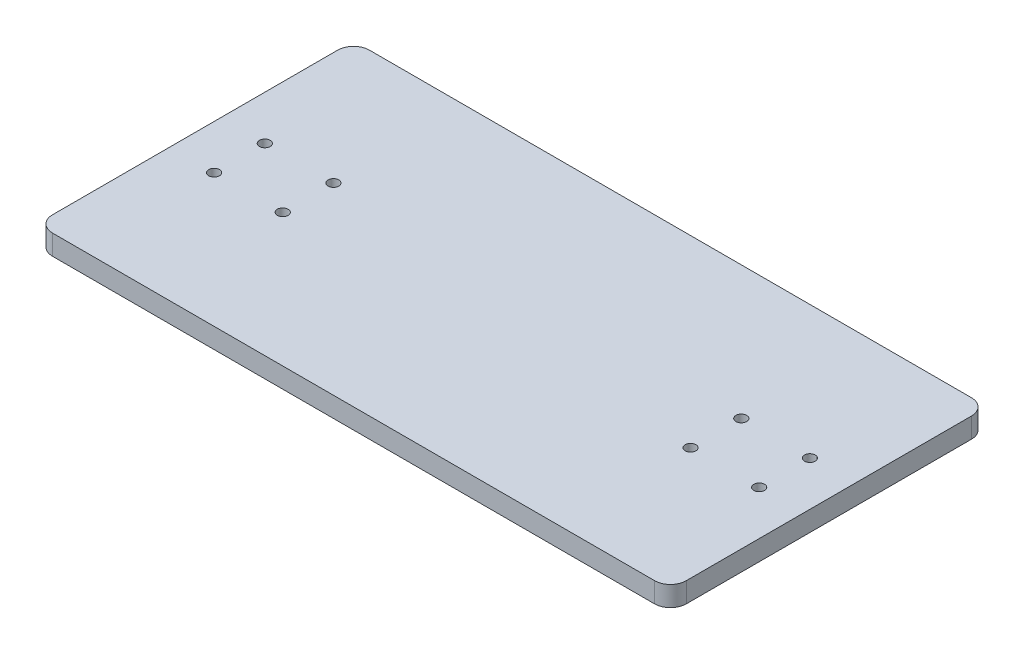
ISO-10303-21;
HEADER;
FILE_DESCRIPTION(('STEP AP214'),'2;1');
FILE_NAME('part.step','',(''),(''),'','','');
FILE_SCHEMA(('AUTOMOTIVE_DESIGN { 1 0 10303 214 1 1 1 1 }'));
ENDSEC;
DATA;
#1=APPLICATION_CONTEXT('core data for automotive mechanical design processes');
#2=APPLICATION_PROTOCOL_DEFINITION('international standard','automotive_design',2000,#1);
#3=PRODUCT_CONTEXT('',#1,'mechanical');
#4=PRODUCT('Part','Part','',(#3));
#5=PRODUCT_RELATED_PRODUCT_CATEGORY('part','',(#4));
#6=PRODUCT_DEFINITION_FORMATION('','',#4);
#7=PRODUCT_DEFINITION_CONTEXT('part definition',#1,'design');
#8=PRODUCT_DEFINITION('design','',#6,#7);
#9=PRODUCT_DEFINITION_SHAPE('','',#8);
#10=(LENGTH_UNIT() NAMED_UNIT(*) SI_UNIT(.MILLI.,.METRE.));
#11=(NAMED_UNIT(*) PLANE_ANGLE_UNIT() SI_UNIT($,.RADIAN.));
#12=(NAMED_UNIT(*) SI_UNIT($,.STERADIAN.) SOLID_ANGLE_UNIT());
#13=UNCERTAINTY_MEASURE_WITH_UNIT(LENGTH_MEASURE(1.E-05),#10,'distance_accuracy_value','');
#14=(GEOMETRIC_REPRESENTATION_CONTEXT(3) GLOBAL_UNCERTAINTY_ASSIGNED_CONTEXT((#13)) GLOBAL_UNIT_ASSIGNED_CONTEXT((#10,
#11,#12)) REPRESENTATION_CONTEXT('',''));
#15=CARTESIAN_POINT('',(0.,0.,0.));
#16=DIRECTION('',(0.,0.,1.));
#17=DIRECTION('',(1.,0.,0.));
#18=AXIS2_PLACEMENT_3D('',#15,#16,#17);
#19=CARTESIAN_POINT('',(0.,6.35,0.));
#20=DIRECTION('',(0.,1.,0.));
#21=DIRECTION('',(0.,0.,1.));
#22=AXIS2_PLACEMENT_3D('',#19,#20,#21);
#23=PLANE('',#22);
#24=CARTESIAN_POINT('',(64.35,6.35,8.));
#25=DIRECTION('',(0.,1.,0.));
#26=DIRECTION('',(0.,0.,1.));
#27=AXIS2_PLACEMENT_3D('',#24,#25,#26);
#28=CIRCLE('',#27,1.7);
#29=CARTESIAN_POINT('',(64.35,6.35,9.7));
#30=VERTEX_POINT('',#29);
#31=EDGE_CURVE('E255',#30,#30,#28,.T.);
#32=ORIENTED_EDGE('',*,*,#31,.F.);
#33=EDGE_LOOP('',(#32));
#34=FACE_BOUND('',#33,.T.);
#35=CARTESIAN_POINT('',(-64.35,6.35,-7.99999999999999));
#36=DIRECTION('',(0.,1.,0.));
#37=DIRECTION('',(0.,0.,1.));
#38=AXIS2_PLACEMENT_3D('',#35,#36,#37);
#39=CIRCLE('',#38,1.7);
#40=CARTESIAN_POINT('',(-64.35,6.35,-6.3));
#41=VERTEX_POINT('',#40);
#42=EDGE_CURVE('E239',#41,#41,#39,.T.);
#43=ORIENTED_EDGE('',*,*,#42,.F.);
#44=EDGE_LOOP('',(#43));
#45=FACE_BOUND('',#44,.T.);
#46=CARTESIAN_POINT('',(86.,6.35,8.00000000000001));
#47=DIRECTION('',(0.,1.,0.));
#48=DIRECTION('',(0.,0.,1.));
#49=AXIS2_PLACEMENT_3D('',#46,#47,#48);
#50=CIRCLE('',#49,1.7);
#51=CARTESIAN_POINT('',(86.,6.35,9.70000000000001));
#52=VERTEX_POINT('',#51);
#53=EDGE_CURVE('E223',#52,#52,#50,.T.);
#54=ORIENTED_EDGE('',*,*,#53,.F.);
#55=EDGE_LOOP('',(#54));
#56=FACE_BOUND('',#55,.T.);
#57=CARTESIAN_POINT('',(-86.,6.35,-8.));
#58=DIRECTION('',(0.,1.,0.));
#59=DIRECTION('',(0.,0.,1.));
#60=AXIS2_PLACEMENT_3D('',#57,#58,#59);
#61=CIRCLE('',#60,1.7);
#62=CARTESIAN_POINT('',(-86.,6.35,-6.3));
#63=VERTEX_POINT('',#62);
#64=EDGE_CURVE('E141',#63,#63,#61,.T.);
#65=ORIENTED_EDGE('',*,*,#64,.F.);
#66=EDGE_LOOP('',(#65));
#67=FACE_BOUND('',#66,.T.);
#68=DIRECTION('',(-1.,0.,0.));
#69=VECTOR('',#68,1.);
#70=CARTESIAN_POINT('',(100.,6.35,-50.));
#71=LINE('',#70,#69);
#72=CARTESIAN_POINT('',(95.,6.35,-50.));
#73=VERTEX_POINT('',#72);
#74=CARTESIAN_POINT('',(-95.,6.35,-50.));
#75=VERTEX_POINT('',#74);
#76=EDGE_CURVE('E152',#73,#75,#71,.T.);
#77=ORIENTED_EDGE('',*,*,#76,.T.);
#78=CARTESIAN_POINT('',(-95.,6.35,-45.));
#79=DIRECTION('',(0.,1.,0.));
#80=DIRECTION('',(0.,0.,1.));
#81=AXIS2_PLACEMENT_3D('',#78,#79,#80);
#82=CIRCLE('',#81,5.);
#83=CARTESIAN_POINT('',(-100.,6.35,-45.));
#84=VERTEX_POINT('',#83);
#85=EDGE_CURVE('E182',#75,#84,#82,.T.);
#86=ORIENTED_EDGE('',*,*,#85,.T.);
#87=DIRECTION('',(0.,0.,1.));
#88=VECTOR('',#87,1.);
#89=CARTESIAN_POINT('',(-100.,6.35,50.));
#90=LINE('',#89,#88);
#91=CARTESIAN_POINT('',(-100.,6.35,45.));
#92=VERTEX_POINT('',#91);
#93=EDGE_CURVE('E131',#84,#92,#90,.T.);
#94=ORIENTED_EDGE('',*,*,#93,.T.);
#95=CARTESIAN_POINT('',(-95.,6.35,45.));
#96=DIRECTION('',(0.,1.,0.));
#97=DIRECTION('',(0.,0.,1.));
#98=AXIS2_PLACEMENT_3D('',#95,#96,#97);
#99=CIRCLE('',#98,5.);
#100=CARTESIAN_POINT('',(-95.,6.35,50.));
#101=VERTEX_POINT('',#100);
#102=EDGE_CURVE('E174',#92,#101,#99,.T.);
#103=ORIENTED_EDGE('',*,*,#102,.T.);
#104=DIRECTION('',(1.,0.,0.));
#105=VECTOR('',#104,1.);
#106=CARTESIAN_POINT('',(100.,6.35,50.));
#107=LINE('',#106,#105);
#108=CARTESIAN_POINT('',(95.,6.35,50.));
#109=VERTEX_POINT('',#108);
#110=EDGE_CURVE('E197',#101,#109,#107,.T.);
#111=ORIENTED_EDGE('',*,*,#110,.T.);
#112=CARTESIAN_POINT('',(95.,6.35,45.));
#113=DIRECTION('',(0.,1.,0.));
#114=DIRECTION('',(0.,0.,1.));
#115=AXIS2_PLACEMENT_3D('',#112,#113,#114);
#116=CIRCLE('',#115,5.);
#117=CARTESIAN_POINT('',(100.,6.35,45.));
#118=VERTEX_POINT('',#117);
#119=EDGE_CURVE('E66',#109,#118,#116,.T.);
#120=ORIENTED_EDGE('',*,*,#119,.T.);
#121=DIRECTION('',(0.,0.,-1.));
#122=VECTOR('',#121,1.);
#123=CARTESIAN_POINT('',(100.,6.35,50.));
#124=LINE('',#123,#122);
#125=CARTESIAN_POINT('',(100.,6.35,-45.));
#126=VERTEX_POINT('',#125);
#127=EDGE_CURVE('E205',#118,#126,#124,.T.);
#128=ORIENTED_EDGE('',*,*,#127,.T.);
#129=CARTESIAN_POINT('',(95.,6.35,-45.));
#130=DIRECTION('',(0.,1.,0.));
#131=DIRECTION('',(0.,0.,1.));
#132=AXIS2_PLACEMENT_3D('',#129,#130,#131);
#133=CIRCLE('',#132,5.);
#134=EDGE_CURVE('E179',#126,#73,#133,.T.);
#135=ORIENTED_EDGE('',*,*,#134,.T.);
#136=EDGE_LOOP('',(#77,#86,#94,#103,#111,#120,#128,#135));
#137=FACE_BOUND('',#136,.T.);
#138=CARTESIAN_POINT('',(-86.,6.35,8.00000000000001));
#139=DIRECTION('',(0.,1.,0.));
#140=DIRECTION('',(0.,0.,-1.));
#141=AXIS2_PLACEMENT_3D('',#138,#139,#140);
#142=CIRCLE('',#141,1.7);
#143=CARTESIAN_POINT('',(-86.,6.35,6.30000000000001));
#144=VERTEX_POINT('',#143);
#145=EDGE_CURVE('E217',#144,#144,#142,.T.);
#146=ORIENTED_EDGE('',*,*,#145,.F.);
#147=EDGE_LOOP('',(#146));
#148=FACE_BOUND('',#147,.T.);
#149=CARTESIAN_POINT('',(86.,6.35,-8.));
#150=DIRECTION('',(0.,1.,0.));
#151=DIRECTION('',(0.,0.,-1.));
#152=AXIS2_PLACEMENT_3D('',#149,#150,#151);
#153=CIRCLE('',#152,1.7);
#154=CARTESIAN_POINT('',(86.,6.35,-9.7));
#155=VERTEX_POINT('',#154);
#156=EDGE_CURVE('E231',#155,#155,#153,.T.);
#157=ORIENTED_EDGE('',*,*,#156,.F.);
#158=EDGE_LOOP('',(#157));
#159=FACE_BOUND('',#158,.T.);
#160=CARTESIAN_POINT('',(-64.35,6.35,8.));
#161=DIRECTION('',(0.,1.,0.));
#162=DIRECTION('',(0.,0.,-1.));
#163=AXIS2_PLACEMENT_3D('',#160,#161,#162);
#164=CIRCLE('',#163,1.7);
#165=CARTESIAN_POINT('',(-64.35,6.35,6.3));
#166=VERTEX_POINT('',#165);
#167=EDGE_CURVE('E247',#166,#166,#164,.T.);
#168=ORIENTED_EDGE('',*,*,#167,.F.);
#169=EDGE_LOOP('',(#168));
#170=FACE_BOUND('',#169,.T.);
#171=CARTESIAN_POINT('',(64.35,6.35,-7.99999999999999));
#172=DIRECTION('',(0.,1.,0.));
#173=DIRECTION('',(0.,0.,-1.));
#174=AXIS2_PLACEMENT_3D('',#171,#172,#173);
#175=CIRCLE('',#174,1.7);
#176=CARTESIAN_POINT('',(64.35,6.35,-9.69999999999999));
#177=VERTEX_POINT('',#176);
#178=EDGE_CURVE('E263',#177,#177,#175,.T.);
#179=ORIENTED_EDGE('',*,*,#178,.F.);
#180=EDGE_LOOP('',(#179));
#181=FACE_BOUND('',#180,.T.);
#182=ADVANCED_FACE('F43',(#34,#45,#56,#67,#137,#148,#159,#170,#181),#23,.T.);
#183=CARTESIAN_POINT('',(0.,0.,0.));
#184=DIRECTION('',(0.,1.,0.));
#185=DIRECTION('',(0.,0.,1.));
#186=AXIS2_PLACEMENT_3D('',#183,#184,#185);
#187=PLANE('',#186);
#188=DIRECTION('',(0.,0.,1.));
#189=VECTOR('',#188,1.);
#190=CARTESIAN_POINT('',(-100.,0.,50.));
#191=LINE('',#190,#189);
#192=CARTESIAN_POINT('',(-100.,0.,-45.));
#193=VERTEX_POINT('',#192);
#194=CARTESIAN_POINT('',(-100.,0.,45.));
#195=VERTEX_POINT('',#194);
#196=EDGE_CURVE('E128',#193,#195,#191,.T.);
#197=ORIENTED_EDGE('',*,*,#196,.F.);
#198=CARTESIAN_POINT('',(-95.,0.,-45.));
#199=DIRECTION('',(0.,1.,0.));
#200=DIRECTION('',(0.,0.,1.));
#201=AXIS2_PLACEMENT_3D('',#198,#199,#200);
#202=CIRCLE('',#201,5.);
#203=CARTESIAN_POINT('',(-95.,0.,-50.));
#204=VERTEX_POINT('',#203);
#205=EDGE_CURVE('E110',#193,#204,#202,.F.);
#206=ORIENTED_EDGE('',*,*,#205,.T.);
#207=DIRECTION('',(-1.,0.,0.));
#208=VECTOR('',#207,1.);
#209=CARTESIAN_POINT('',(100.,0.,-50.));
#210=LINE('',#209,#208);
#211=CARTESIAN_POINT('',(95.,0.,-50.));
#212=VERTEX_POINT('',#211);
#213=EDGE_CURVE('E157',#212,#204,#210,.T.);
#214=ORIENTED_EDGE('',*,*,#213,.F.);
#215=CARTESIAN_POINT('',(95.,0.,-45.));
#216=DIRECTION('',(0.,1.,0.));
#217=DIRECTION('',(0.,0.,1.));
#218=AXIS2_PLACEMENT_3D('',#215,#216,#217);
#219=CIRCLE('',#218,5.);
#220=CARTESIAN_POINT('',(100.,0.,-45.));
#221=VERTEX_POINT('',#220);
#222=EDGE_CURVE('E122',#212,#221,#219,.F.);
#223=ORIENTED_EDGE('',*,*,#222,.T.);
#224=DIRECTION('',(0.,0.,-1.));
#225=VECTOR('',#224,1.);
#226=CARTESIAN_POINT('',(100.,0.,50.));
#227=LINE('',#226,#225);
#228=CARTESIAN_POINT('',(100.,0.,45.));
#229=VERTEX_POINT('',#228);
#230=EDGE_CURVE('E146',#229,#221,#227,.T.);
#231=ORIENTED_EDGE('',*,*,#230,.F.);
#232=CARTESIAN_POINT('',(95.,0.,45.));
#233=DIRECTION('',(0.,1.,0.));
#234=DIRECTION('',(0.,0.,1.));
#235=AXIS2_PLACEMENT_3D('',#232,#233,#234);
#236=CIRCLE('',#235,5.);
#237=CARTESIAN_POINT('',(95.,0.,50.));
#238=VERTEX_POINT('',#237);
#239=EDGE_CURVE('E164',#229,#238,#236,.F.);
#240=ORIENTED_EDGE('',*,*,#239,.T.);
#241=DIRECTION('',(1.,0.,0.));
#242=VECTOR('',#241,1.);
#243=CARTESIAN_POINT('',(100.,0.,50.));
#244=LINE('',#243,#242);
#245=CARTESIAN_POINT('',(-95.,0.,50.));
#246=VERTEX_POINT('',#245);
#247=EDGE_CURVE('E140',#246,#238,#244,.T.);
#248=ORIENTED_EDGE('',*,*,#247,.F.);
#249=CARTESIAN_POINT('',(-95.,0.,45.));
#250=DIRECTION('',(0.,1.,0.));
#251=DIRECTION('',(0.,0.,1.));
#252=AXIS2_PLACEMENT_3D('',#249,#250,#251);
#253=CIRCLE('',#252,5.);
#254=EDGE_CURVE('E133',#246,#195,#253,.F.);
#255=ORIENTED_EDGE('',*,*,#254,.T.);
#256=EDGE_LOOP('',(#197,#206,#214,#223,#231,#240,#248,#255));
#257=FACE_BOUND('',#256,.T.);
#258=CARTESIAN_POINT('',(-86.,0.,-8.));
#259=DIRECTION('',(0.,1.,0.));
#260=DIRECTION('',(0.,0.,1.));
#261=AXIS2_PLACEMENT_3D('',#258,#259,#260);
#262=CIRCLE('',#261,1.7);
#263=CARTESIAN_POINT('',(-86.,0.,-6.3));
#264=VERTEX_POINT('',#263);
#265=EDGE_CURVE('E149',#264,#264,#262,.T.);
#266=ORIENTED_EDGE('',*,*,#265,.T.);
#267=EDGE_LOOP('',(#266));
#268=FACE_BOUND('',#267,.T.);
#269=CARTESIAN_POINT('',(-86.,0.,8.00000000000001));
#270=DIRECTION('',(0.,1.,0.));
#271=DIRECTION('',(0.,0.,-1.));
#272=AXIS2_PLACEMENT_3D('',#269,#270,#271);
#273=CIRCLE('',#272,1.7);
#274=CARTESIAN_POINT('',(-86.,0.,6.30000000000001));
#275=VERTEX_POINT('',#274);
#276=EDGE_CURVE('E219',#275,#275,#273,.T.);
#277=ORIENTED_EDGE('',*,*,#276,.T.);
#278=EDGE_LOOP('',(#277));
#279=FACE_BOUND('',#278,.T.);
#280=CARTESIAN_POINT('',(86.,0.,8.00000000000001));
#281=DIRECTION('',(0.,1.,0.));
#282=DIRECTION('',(0.,0.,1.));
#283=AXIS2_PLACEMENT_3D('',#280,#281,#282);
#284=CIRCLE('',#283,1.7);
#285=CARTESIAN_POINT('',(86.,0.,9.70000000000001));
#286=VERTEX_POINT('',#285);
#287=EDGE_CURVE('E227',#286,#286,#284,.T.);
#288=ORIENTED_EDGE('',*,*,#287,.T.);
#289=EDGE_LOOP('',(#288));
#290=FACE_BOUND('',#289,.T.);
#291=CARTESIAN_POINT('',(86.,0.,-8.));
#292=DIRECTION('',(0.,1.,0.));
#293=DIRECTION('',(0.,0.,-1.));
#294=AXIS2_PLACEMENT_3D('',#291,#292,#293);
#295=CIRCLE('',#294,1.7);
#296=CARTESIAN_POINT('',(86.,0.,-9.7));
#297=VERTEX_POINT('',#296);
#298=EDGE_CURVE('E235',#297,#297,#295,.T.);
#299=ORIENTED_EDGE('',*,*,#298,.T.);
#300=EDGE_LOOP('',(#299));
#301=FACE_BOUND('',#300,.T.);
#302=CARTESIAN_POINT('',(-64.35,0.,-7.99999999999999));
#303=DIRECTION('',(0.,1.,0.));
#304=DIRECTION('',(0.,0.,1.));
#305=AXIS2_PLACEMENT_3D('',#302,#303,#304);
#306=CIRCLE('',#305,1.7);
#307=CARTESIAN_POINT('',(-64.35,0.,-6.3));
#308=VERTEX_POINT('',#307);
#309=EDGE_CURVE('E243',#308,#308,#306,.T.);
#310=ORIENTED_EDGE('',*,*,#309,.T.);
#311=EDGE_LOOP('',(#310));
#312=FACE_BOUND('',#311,.T.);
#313=CARTESIAN_POINT('',(-64.35,0.,8.));
#314=DIRECTION('',(0.,1.,0.));
#315=DIRECTION('',(0.,0.,-1.));
#316=AXIS2_PLACEMENT_3D('',#313,#314,#315);
#317=CIRCLE('',#316,1.7);
#318=CARTESIAN_POINT('',(-64.35,0.,6.3));
#319=VERTEX_POINT('',#318);
#320=EDGE_CURVE('E251',#319,#319,#317,.T.);
#321=ORIENTED_EDGE('',*,*,#320,.T.);
#322=EDGE_LOOP('',(#321));
#323=FACE_BOUND('',#322,.T.);
#324=CARTESIAN_POINT('',(64.35,0.,8.));
#325=DIRECTION('',(0.,1.,0.));
#326=DIRECTION('',(0.,0.,1.));
#327=AXIS2_PLACEMENT_3D('',#324,#325,#326);
#328=CIRCLE('',#327,1.7);
#329=CARTESIAN_POINT('',(64.35,0.,9.7));
#330=VERTEX_POINT('',#329);
#331=EDGE_CURVE('E259',#330,#330,#328,.T.);
#332=ORIENTED_EDGE('',*,*,#331,.T.);
#333=EDGE_LOOP('',(#332));
#334=FACE_BOUND('',#333,.T.);
#335=CARTESIAN_POINT('',(64.35,0.,-7.99999999999999));
#336=DIRECTION('',(0.,1.,0.));
#337=DIRECTION('',(0.,0.,-1.));
#338=AXIS2_PLACEMENT_3D('',#335,#336,#337);
#339=CIRCLE('',#338,1.7);
#340=CARTESIAN_POINT('',(64.35,0.,-9.69999999999999));
#341=VERTEX_POINT('',#340);
#342=EDGE_CURVE('E267',#341,#341,#339,.T.);
#343=ORIENTED_EDGE('',*,*,#342,.T.);
#344=EDGE_LOOP('',(#343));
#345=FACE_BOUND('',#344,.T.);
#346=ADVANCED_FACE('F136',(#257,#268,#279,#290,#301,#312,#323,#334,#345),#187,.F.);
#347=CARTESIAN_POINT('',(-100.,6.35,50.));
#348=DIRECTION('',(1.,0.,0.));
#349=DIRECTION('',(0.,0.,-1.));
#350=AXIS2_PLACEMENT_3D('',#347,#348,#349);
#351=PLANE('',#350);
#352=ORIENTED_EDGE('',*,*,#93,.F.);
#353=DIRECTION('',(0.,-1.,0.));
#354=VECTOR('',#353,1.);
#355=CARTESIAN_POINT('',(-100.,6.35,-45.));
#356=LINE('',#355,#354);
#357=EDGE_CURVE('E114',#84,#193,#356,.T.);
#358=ORIENTED_EDGE('',*,*,#357,.T.);
#359=ORIENTED_EDGE('',*,*,#196,.T.);
#360=DIRECTION('',(0.,-1.,0.));
#361=VECTOR('',#360,1.);
#362=CARTESIAN_POINT('',(-100.,6.35,45.));
#363=LINE('',#362,#361);
#364=EDGE_CURVE('E134',#195,#92,#363,.F.);
#365=ORIENTED_EDGE('',*,*,#364,.T.);
#366=EDGE_LOOP('',(#352,#358,#359,#365));
#367=FACE_BOUND('',#366,.T.);
#368=ADVANCED_FACE('F127',(#367),#351,.F.);
#369=CARTESIAN_POINT('',(100.,6.35,50.));
#370=DIRECTION('',(0.,0.,-1.));
#371=DIRECTION('',(-1.,0.,0.));
#372=AXIS2_PLACEMENT_3D('',#369,#370,#371);
#373=PLANE('',#372);
#374=ORIENTED_EDGE('',*,*,#247,.T.);
#375=DIRECTION('',(0.,-1.,0.));
#376=VECTOR('',#375,1.);
#377=CARTESIAN_POINT('',(95.,6.35,50.));
#378=LINE('',#377,#376);
#379=EDGE_CURVE('E11',#238,#109,#378,.F.);
#380=ORIENTED_EDGE('',*,*,#379,.T.);
#381=ORIENTED_EDGE('',*,*,#110,.F.);
#382=DIRECTION('',(0.,-1.,0.));
#383=VECTOR('',#382,1.);
#384=CARTESIAN_POINT('',(-95.,6.35,50.));
#385=LINE('',#384,#383);
#386=EDGE_CURVE('E52',#101,#246,#385,.T.);
#387=ORIENTED_EDGE('',*,*,#386,.T.);
#388=EDGE_LOOP('',(#374,#380,#381,#387));
#389=FACE_BOUND('',#388,.T.);
#390=ADVANCED_FACE('F195',(#389),#373,.F.);
#391=CARTESIAN_POINT('',(100.,6.35,50.));
#392=DIRECTION('',(-1.,0.,0.));
#393=DIRECTION('',(0.,0.,1.));
#394=AXIS2_PLACEMENT_3D('',#391,#392,#393);
#395=PLANE('',#394);
#396=ORIENTED_EDGE('',*,*,#230,.T.);
#397=DIRECTION('',(0.,-1.,0.));
#398=VECTOR('',#397,1.);
#399=CARTESIAN_POINT('',(100.,6.35,-45.));
#400=LINE('',#399,#398);
#401=EDGE_CURVE('E59',#221,#126,#400,.F.);
#402=ORIENTED_EDGE('',*,*,#401,.T.);
#403=ORIENTED_EDGE('',*,*,#127,.F.);
#404=DIRECTION('',(0.,-1.,0.));
#405=VECTOR('',#404,1.);
#406=CARTESIAN_POINT('',(100.,6.35,45.));
#407=LINE('',#406,#405);
#408=EDGE_CURVE('E185',#118,#229,#407,.T.);
#409=ORIENTED_EDGE('',*,*,#408,.T.);
#410=EDGE_LOOP('',(#396,#402,#403,#409));
#411=FACE_BOUND('',#410,.T.);
#412=ADVANCED_FACE('F204',(#411),#395,.F.);
#413=CARTESIAN_POINT('',(100.,6.35,-50.));
#414=DIRECTION('',(0.,0.,1.));
#415=DIRECTION('',(1.,0.,0.));
#416=AXIS2_PLACEMENT_3D('',#413,#414,#415);
#417=PLANE('',#416);
#418=ORIENTED_EDGE('',*,*,#213,.T.);
#419=DIRECTION('',(0.,-1.,0.));
#420=VECTOR('',#419,1.);
#421=CARTESIAN_POINT('',(-95.,6.35,-50.));
#422=LINE('',#421,#420);
#423=EDGE_CURVE('E115',#204,#75,#422,.F.);
#424=ORIENTED_EDGE('',*,*,#423,.T.);
#425=ORIENTED_EDGE('',*,*,#76,.F.);
#426=DIRECTION('',(0.,-1.,0.));
#427=VECTOR('',#426,1.);
#428=CARTESIAN_POINT('',(95.,6.35,-50.));
#429=LINE('',#428,#427);
#430=EDGE_CURVE('E121',#73,#212,#429,.T.);
#431=ORIENTED_EDGE('',*,*,#430,.T.);
#432=EDGE_LOOP('',(#418,#424,#425,#431));
#433=FACE_BOUND('',#432,.T.);
#434=ADVANCED_FACE('F291',(#433),#417,.F.);
#435=CARTESIAN_POINT('',(-86.,6.35,-8.));
#436=DIRECTION('',(0.,-1.,0.));
#437=DIRECTION('',(0.,0.,-1.));
#438=AXIS2_PLACEMENT_3D('',#435,#436,#437);
#439=CYLINDRICAL_SURFACE('',#438,1.7);
#440=ORIENTED_EDGE('',*,*,#64,.T.);
#441=EDGE_LOOP('',(#440));
#442=FACE_BOUND('',#441,.T.);
#443=ORIENTED_EDGE('',*,*,#265,.F.);
#444=EDGE_LOOP('',(#443));
#445=FACE_BOUND('',#444,.T.);
#446=ADVANCED_FACE('F288',(#442,#445),#439,.F.);
#447=CARTESIAN_POINT('',(-86.,6.35,8.00000000000001));
#448=DIRECTION('',(0.,-1.,0.));
#449=DIRECTION('',(0.,0.,-1.));
#450=AXIS2_PLACEMENT_3D('',#447,#448,#449);
#451=CYLINDRICAL_SURFACE('',#450,1.7);
#452=ORIENTED_EDGE('',*,*,#145,.T.);
#453=EDGE_LOOP('',(#452));
#454=FACE_BOUND('',#453,.T.);
#455=ORIENTED_EDGE('',*,*,#276,.F.);
#456=EDGE_LOOP('',(#455));
#457=FACE_BOUND('',#456,.T.);
#458=ADVANCED_FACE('F350',(#454,#457),#451,.F.);
#459=CARTESIAN_POINT('',(86.,6.35,8.00000000000001));
#460=DIRECTION('',(0.,-1.,0.));
#461=DIRECTION('',(0.,0.,-1.));
#462=AXIS2_PLACEMENT_3D('',#459,#460,#461);
#463=CYLINDRICAL_SURFACE('',#462,1.7);
#464=ORIENTED_EDGE('',*,*,#53,.T.);
#465=EDGE_LOOP('',(#464));
#466=FACE_BOUND('',#465,.T.);
#467=ORIENTED_EDGE('',*,*,#287,.F.);
#468=EDGE_LOOP('',(#467));
#469=FACE_BOUND('',#468,.T.);
#470=ADVANCED_FACE('F347',(#466,#469),#463,.F.);
#471=CARTESIAN_POINT('',(86.,6.35,-8.));
#472=DIRECTION('',(0.,-1.,0.));
#473=DIRECTION('',(0.,0.,-1.));
#474=AXIS2_PLACEMENT_3D('',#471,#472,#473);
#475=CYLINDRICAL_SURFACE('',#474,1.7);
#476=ORIENTED_EDGE('',*,*,#156,.T.);
#477=EDGE_LOOP('',(#476));
#478=FACE_BOUND('',#477,.T.);
#479=ORIENTED_EDGE('',*,*,#298,.F.);
#480=EDGE_LOOP('',(#479));
#481=FACE_BOUND('',#480,.T.);
#482=ADVANCED_FACE('F343',(#478,#481),#475,.F.);
#483=CARTESIAN_POINT('',(-64.35,6.35,-7.99999999999999));
#484=DIRECTION('',(0.,-1.,0.));
#485=DIRECTION('',(0.,0.,-1.));
#486=AXIS2_PLACEMENT_3D('',#483,#484,#485);
#487=CYLINDRICAL_SURFACE('',#486,1.7);
#488=ORIENTED_EDGE('',*,*,#42,.T.);
#489=EDGE_LOOP('',(#488));
#490=FACE_BOUND('',#489,.T.);
#491=ORIENTED_EDGE('',*,*,#309,.F.);
#492=EDGE_LOOP('',(#491));
#493=FACE_BOUND('',#492,.T.);
#494=ADVANCED_FACE('F325',(#490,#493),#487,.F.);
#495=CARTESIAN_POINT('',(-64.35,6.35,8.));
#496=DIRECTION('',(0.,-1.,0.));
#497=DIRECTION('',(0.,0.,-1.));
#498=AXIS2_PLACEMENT_3D('',#495,#496,#497);
#499=CYLINDRICAL_SURFACE('',#498,1.7);
#500=ORIENTED_EDGE('',*,*,#167,.T.);
#501=EDGE_LOOP('',(#500));
#502=FACE_BOUND('',#501,.T.);
#503=ORIENTED_EDGE('',*,*,#320,.F.);
#504=EDGE_LOOP('',(#503));
#505=FACE_BOUND('',#504,.T.);
#506=ADVANCED_FACE('F321',(#502,#505),#499,.F.);
#507=CARTESIAN_POINT('',(64.35,6.35,8.));
#508=DIRECTION('',(0.,-1.,0.));
#509=DIRECTION('',(0.,0.,-1.));
#510=AXIS2_PLACEMENT_3D('',#507,#508,#509);
#511=CYLINDRICAL_SURFACE('',#510,1.7);
#512=ORIENTED_EDGE('',*,*,#31,.T.);
#513=EDGE_LOOP('',(#512));
#514=FACE_BOUND('',#513,.T.);
#515=ORIENTED_EDGE('',*,*,#331,.F.);
#516=EDGE_LOOP('',(#515));
#517=FACE_BOUND('',#516,.T.);
#518=ADVANCED_FACE('F324',(#514,#517),#511,.F.);
#519=CARTESIAN_POINT('',(64.35,6.35,-7.99999999999999));
#520=DIRECTION('',(0.,-1.,0.));
#521=DIRECTION('',(0.,0.,-1.));
#522=AXIS2_PLACEMENT_3D('',#519,#520,#521);
#523=CYLINDRICAL_SURFACE('',#522,1.7);
#524=ORIENTED_EDGE('',*,*,#178,.T.);
#525=EDGE_LOOP('',(#524));
#526=FACE_BOUND('',#525,.T.);
#527=ORIENTED_EDGE('',*,*,#342,.F.);
#528=EDGE_LOOP('',(#527));
#529=FACE_BOUND('',#528,.T.);
#530=ADVANCED_FACE('F275',(#526,#529),#523,.F.);
#531=CARTESIAN_POINT('',(-95.,6.35,-45.));
#532=DIRECTION('',(0.,-1.,0.));
#533=DIRECTION('',(0.,0.,-1.));
#534=AXIS2_PLACEMENT_3D('',#531,#532,#533);
#535=CYLINDRICAL_SURFACE('',#534,5.);
#536=ORIENTED_EDGE('',*,*,#85,.F.);
#537=ORIENTED_EDGE('',*,*,#423,.F.);
#538=ORIENTED_EDGE('',*,*,#205,.F.);
#539=ORIENTED_EDGE('',*,*,#357,.F.);
#540=EDGE_LOOP('',(#536,#537,#538,#539));
#541=FACE_BOUND('',#540,.T.);
#542=ADVANCED_FACE('F113',(#541),#535,.T.);
#543=CARTESIAN_POINT('',(95.,6.35,-45.));
#544=DIRECTION('',(0.,-1.,0.));
#545=DIRECTION('',(0.,0.,-1.));
#546=AXIS2_PLACEMENT_3D('',#543,#544,#545);
#547=CYLINDRICAL_SURFACE('',#546,5.);
#548=ORIENTED_EDGE('',*,*,#134,.F.);
#549=ORIENTED_EDGE('',*,*,#401,.F.);
#550=ORIENTED_EDGE('',*,*,#222,.F.);
#551=ORIENTED_EDGE('',*,*,#430,.F.);
#552=EDGE_LOOP('',(#548,#549,#550,#551));
#553=FACE_BOUND('',#552,.T.);
#554=ADVANCED_FACE('F303',(#553),#547,.T.);
#555=CARTESIAN_POINT('',(95.,6.35,45.));
#556=DIRECTION('',(0.,-1.,0.));
#557=DIRECTION('',(0.,0.,-1.));
#558=AXIS2_PLACEMENT_3D('',#555,#556,#557);
#559=CYLINDRICAL_SURFACE('',#558,5.);
#560=ORIENTED_EDGE('',*,*,#119,.F.);
#561=ORIENTED_EDGE('',*,*,#379,.F.);
#562=ORIENTED_EDGE('',*,*,#239,.F.);
#563=ORIENTED_EDGE('',*,*,#408,.F.);
#564=EDGE_LOOP('',(#560,#561,#562,#563));
#565=FACE_BOUND('',#564,.T.);
#566=ADVANCED_FACE('F203',(#565),#559,.T.);
#567=CARTESIAN_POINT('',(-95.,6.35,45.));
#568=DIRECTION('',(0.,-1.,0.));
#569=DIRECTION('',(0.,0.,-1.));
#570=AXIS2_PLACEMENT_3D('',#567,#568,#569);
#571=CYLINDRICAL_SURFACE('',#570,5.);
#572=ORIENTED_EDGE('',*,*,#102,.F.);
#573=ORIENTED_EDGE('',*,*,#364,.F.);
#574=ORIENTED_EDGE('',*,*,#254,.F.);
#575=ORIENTED_EDGE('',*,*,#386,.F.);
#576=EDGE_LOOP('',(#572,#573,#574,#575));
#577=FACE_BOUND('',#576,.T.);
#578=ADVANCED_FACE('F45',(#577),#571,.T.);
#579=CLOSED_SHELL('',(#182,#346,#368,#390,#412,#434,#446,#458,#470,#482,#494,#506,#518,#530,
#542,#554,#566,#578));
#580=MANIFOLD_SOLID_BREP('B2',#579);
#581=ADVANCED_BREP_SHAPE_REPRESENTATION('',(#18,#580),#14);
#582=SHAPE_DEFINITION_REPRESENTATION(#9,#581);
ENDSEC;
END-ISO-10303-21;
